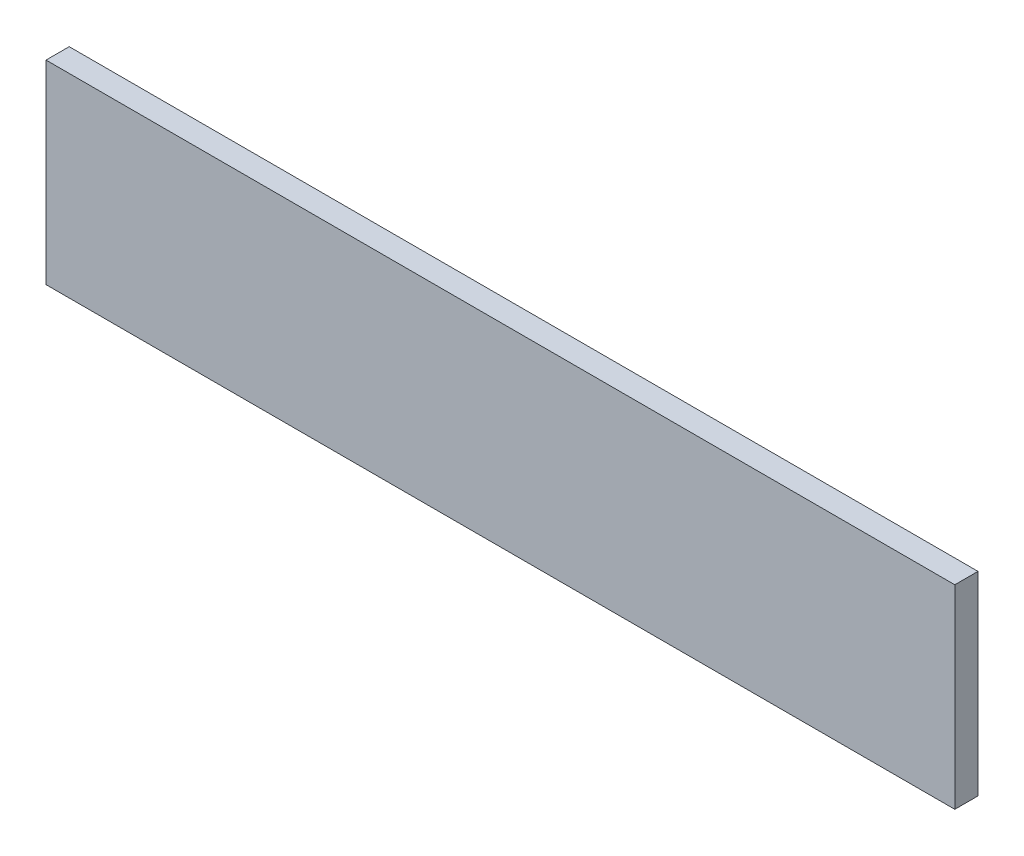
ISO-10303-21;
HEADER;
FILE_DESCRIPTION(('STEP AP214'),'2;1');
FILE_NAME('part.step','',(''),(''),'','','');
FILE_SCHEMA(('AUTOMOTIVE_DESIGN { 1 0 10303 214 1 1 1 1 }'));
ENDSEC;
DATA;
#1=APPLICATION_CONTEXT('core data for automotive mechanical design processes');
#2=APPLICATION_PROTOCOL_DEFINITION('international standard','automotive_design',2000,#1);
#3=PRODUCT_CONTEXT('',#1,'mechanical');
#4=PRODUCT('Part','Part','',(#3));
#5=PRODUCT_RELATED_PRODUCT_CATEGORY('part','',(#4));
#6=PRODUCT_DEFINITION_FORMATION('','',#4);
#7=PRODUCT_DEFINITION_CONTEXT('part definition',#1,'design');
#8=PRODUCT_DEFINITION('design','',#6,#7);
#9=PRODUCT_DEFINITION_SHAPE('','',#8);
#10=(LENGTH_UNIT() NAMED_UNIT(*) SI_UNIT(.MILLI.,.METRE.));
#11=(NAMED_UNIT(*) PLANE_ANGLE_UNIT() SI_UNIT($,.RADIAN.));
#12=(NAMED_UNIT(*) SI_UNIT($,.STERADIAN.) SOLID_ANGLE_UNIT());
#13=UNCERTAINTY_MEASURE_WITH_UNIT(LENGTH_MEASURE(1.E-05),#10,'distance_accuracy_value','');
#14=(GEOMETRIC_REPRESENTATION_CONTEXT(3) GLOBAL_UNCERTAINTY_ASSIGNED_CONTEXT((#13)) GLOBAL_UNIT_ASSIGNED_CONTEXT((#10,
#11,#12)) REPRESENTATION_CONTEXT('',''));
#15=CARTESIAN_POINT('',(0.,0.,0.));
#16=DIRECTION('',(0.,0.,1.));
#17=DIRECTION('',(1.,0.,0.));
#18=AXIS2_PLACEMENT_3D('',#15,#16,#17);
#19=CARTESIAN_POINT('',(1018.62875354254,-217.994596263324,52.0000000000001));
#20=DIRECTION('',(1.,0.,0.));
#21=DIRECTION('',(0.,0.,-1.));
#22=AXIS2_PLACEMENT_3D('',#19,#20,#21);
#23=PLANE('',#22);
#24=DIRECTION('',(0.,-1.,0.));
#25=VECTOR('',#24,1.);
#26=CARTESIAN_POINT('',(1018.62875354254,-217.994596263324,0.));
#27=LINE('',#26,#25);
#28=CARTESIAN_POINT('',(1018.62875354254,217.994596263324,0.));
#29=VERTEX_POINT('',#28);
#30=CARTESIAN_POINT('',(1018.62875354254,-217.994596263324,0.));
#31=VERTEX_POINT('',#30);
#32=EDGE_CURVE('E117',#29,#31,#27,.T.);
#33=ORIENTED_EDGE('',*,*,#32,.F.);
#34=DIRECTION('',(0.,0.,-1.));
#35=VECTOR('',#34,1.);
#36=CARTESIAN_POINT('',(1018.62875354254,217.994596263324,52.0000000000001));
#37=LINE('',#36,#35);
#38=CARTESIAN_POINT('',(1018.62875354254,217.994596263324,52.0000000000001));
#39=VERTEX_POINT('',#38);
#40=EDGE_CURVE('E12',#39,#29,#37,.T.);
#41=ORIENTED_EDGE('',*,*,#40,.F.);
#42=DIRECTION('',(0.,-1.,0.));
#43=VECTOR('',#42,1.);
#44=CARTESIAN_POINT('',(1018.62875354254,-217.994596263324,52.0000000000001));
#45=LINE('',#44,#43);
#46=CARTESIAN_POINT('',(1018.62875354254,-217.994596263324,52.0000000000001));
#47=VERTEX_POINT('',#46);
#48=EDGE_CURVE('E111',#39,#47,#45,.T.);
#49=ORIENTED_EDGE('',*,*,#48,.T.);
#50=DIRECTION('',(0.,0.,-1.));
#51=VECTOR('',#50,1.);
#52=CARTESIAN_POINT('',(1018.62875354254,-217.994596263324,52.0000000000001));
#53=LINE('',#52,#51);
#54=EDGE_CURVE('E56',#47,#31,#53,.T.);
#55=ORIENTED_EDGE('',*,*,#54,.T.);
#56=EDGE_LOOP('',(#33,#41,#49,#55));
#57=FACE_BOUND('',#56,.T.);
#58=ADVANCED_FACE('F53',(#57),#23,.T.);
#59=CARTESIAN_POINT('',(-1018.62875354254,217.994596263324,52.0000000000001));
#60=DIRECTION('',(0.,1.,0.));
#61=DIRECTION('',(0.,0.,1.));
#62=AXIS2_PLACEMENT_3D('',#59,#60,#61);
#63=PLANE('',#62);
#64=DIRECTION('',(1.,0.,0.));
#65=VECTOR('',#64,1.);
#66=CARTESIAN_POINT('',(-1018.62875354254,217.994596263324,0.));
#67=LINE('',#66,#65);
#68=CARTESIAN_POINT('',(-1018.62875354254,217.994596263324,0.));
#69=VERTEX_POINT('',#68);
#70=EDGE_CURVE('E113',#69,#29,#67,.T.);
#71=ORIENTED_EDGE('',*,*,#70,.F.);
#72=DIRECTION('',(0.,0.,-1.));
#73=VECTOR('',#72,1.);
#74=CARTESIAN_POINT('',(-1018.62875354254,217.994596263324,52.0000000000001));
#75=LINE('',#74,#73);
#76=CARTESIAN_POINT('',(-1018.62875354254,217.994596263324,52.0000000000001));
#77=VERTEX_POINT('',#76);
#78=EDGE_CURVE('E62',#77,#69,#75,.T.);
#79=ORIENTED_EDGE('',*,*,#78,.F.);
#80=DIRECTION('',(1.,0.,0.));
#81=VECTOR('',#80,1.);
#82=CARTESIAN_POINT('',(-1018.62875354254,217.994596263324,52.0000000000001));
#83=LINE('',#82,#81);
#84=EDGE_CURVE('E108',#77,#39,#83,.T.);
#85=ORIENTED_EDGE('',*,*,#84,.T.);
#86=ORIENTED_EDGE('',*,*,#40,.T.);
#87=EDGE_LOOP('',(#71,#79,#85,#86));
#88=FACE_BOUND('',#87,.T.);
#89=ADVANCED_FACE('F127',(#88),#63,.T.);
#90=CARTESIAN_POINT('',(-1018.62875354254,-217.994596263324,52.0000000000001));
#91=DIRECTION('',(-1.,0.,0.));
#92=DIRECTION('',(0.,0.,1.));
#93=AXIS2_PLACEMENT_3D('',#90,#91,#92);
#94=PLANE('',#93);
#95=DIRECTION('',(0.,1.,0.));
#96=VECTOR('',#95,1.);
#97=CARTESIAN_POINT('',(-1018.62875354254,-217.994596263324,0.));
#98=LINE('',#97,#96);
#99=CARTESIAN_POINT('',(-1018.62875354254,-217.994596263324,0.));
#100=VERTEX_POINT('',#99);
#101=EDGE_CURVE('E103',#100,#69,#98,.T.);
#102=ORIENTED_EDGE('',*,*,#101,.F.);
#103=DIRECTION('',(0.,0.,-1.));
#104=VECTOR('',#103,1.);
#105=CARTESIAN_POINT('',(-1018.62875354254,-217.994596263324,52.0000000000001));
#106=LINE('',#105,#104);
#107=CARTESIAN_POINT('',(-1018.62875354254,-217.994596263324,52.0000000000001));
#108=VERTEX_POINT('',#107);
#109=EDGE_CURVE('E98',#108,#100,#106,.T.);
#110=ORIENTED_EDGE('',*,*,#109,.F.);
#111=DIRECTION('',(0.,1.,0.));
#112=VECTOR('',#111,1.);
#113=CARTESIAN_POINT('',(-1018.62875354254,-217.994596263324,52.0000000000001));
#114=LINE('',#113,#112);
#115=EDGE_CURVE('E101',#108,#77,#114,.T.);
#116=ORIENTED_EDGE('',*,*,#115,.T.);
#117=ORIENTED_EDGE('',*,*,#78,.T.);
#118=EDGE_LOOP('',(#102,#110,#116,#117));
#119=FACE_BOUND('',#118,.T.);
#120=ADVANCED_FACE('F100',(#119),#94,.T.);
#121=CARTESIAN_POINT('',(-1018.62875354254,-217.994596263324,52.0000000000001));
#122=DIRECTION('',(0.,-1.,0.));
#123=DIRECTION('',(0.,0.,-1.));
#124=AXIS2_PLACEMENT_3D('',#121,#122,#123);
#125=PLANE('',#124);
#126=DIRECTION('',(-1.,0.,0.));
#127=VECTOR('',#126,1.);
#128=CARTESIAN_POINT('',(-1018.62875354254,-217.994596263324,0.));
#129=LINE('',#128,#127);
#130=EDGE_CURVE('E120',#31,#100,#129,.T.);
#131=ORIENTED_EDGE('',*,*,#130,.F.);
#132=ORIENTED_EDGE('',*,*,#54,.F.);
#133=DIRECTION('',(-1.,0.,0.));
#134=VECTOR('',#133,1.);
#135=CARTESIAN_POINT('',(-1018.62875354254,-217.994596263324,52.0000000000001));
#136=LINE('',#135,#134);
#137=EDGE_CURVE('E107',#47,#108,#136,.T.);
#138=ORIENTED_EDGE('',*,*,#137,.T.);
#139=ORIENTED_EDGE('',*,*,#109,.T.);
#140=EDGE_LOOP('',(#131,#132,#138,#139));
#141=FACE_BOUND('',#140,.T.);
#142=ADVANCED_FACE('F110',(#141),#125,.T.);
#143=CARTESIAN_POINT('',(0.,0.,52.0000000000001));
#144=DIRECTION('',(0.,0.,-1.));
#145=DIRECTION('',(-1.,0.,0.));
#146=AXIS2_PLACEMENT_3D('',#143,#144,#145);
#147=PLANE('',#146);
#148=ORIENTED_EDGE('',*,*,#48,.F.);
#149=ORIENTED_EDGE('',*,*,#84,.F.);
#150=ORIENTED_EDGE('',*,*,#115,.F.);
#151=ORIENTED_EDGE('',*,*,#137,.F.);
#152=EDGE_LOOP('',(#148,#149,#150,#151));
#153=FACE_BOUND('',#152,.T.);
#154=ADVANCED_FACE('F106',(#153),#147,.F.);
#155=CARTESIAN_POINT('',(0.,0.,0.));
#156=DIRECTION('',(0.,0.,-1.));
#157=DIRECTION('',(-1.,0.,0.));
#158=AXIS2_PLACEMENT_3D('',#155,#156,#157);
#159=PLANE('',#158);
#160=ORIENTED_EDGE('',*,*,#32,.T.);
#161=ORIENTED_EDGE('',*,*,#130,.T.);
#162=ORIENTED_EDGE('',*,*,#101,.T.);
#163=ORIENTED_EDGE('',*,*,#70,.T.);
#164=EDGE_LOOP('',(#160,#161,#162,#163));
#165=FACE_BOUND('',#164,.T.);
#166=ADVANCED_FACE('F126',(#165),#159,.T.);
#167=CLOSED_SHELL('',(#58,#89,#120,#142,#154,#166));
#168=MANIFOLD_SOLID_BREP('B2',#167);
#169=CARTESIAN_POINT('',(1000.,200.,40.));
#170=DIRECTION('',(-1.,0.,0.));
#171=DIRECTION('',(0.,0.,1.));
#172=AXIS2_PLACEMENT_3D('',#169,#170,#171);
#173=PLANE('',#172);
#174=DIRECTION('',(0.,1.,0.));
#175=VECTOR('',#174,1.);
#176=CARTESIAN_POINT('',(1000.,200.,0.));
#177=LINE('',#176,#175);
#178=CARTESIAN_POINT('',(1000.,-200.,0.));
#179=VERTEX_POINT('',#178);
#180=CARTESIAN_POINT('',(1000.,200.,0.));
#181=VERTEX_POINT('',#180);
#182=EDGE_CURVE('E240',#179,#181,#177,.T.);
#183=ORIENTED_EDGE('',*,*,#182,.T.);
#184=DIRECTION('',(0.,0.,-1.));
#185=VECTOR('',#184,1.);
#186=CARTESIAN_POINT('',(1000.,200.,40.));
#187=LINE('',#186,#185);
#188=CARTESIAN_POINT('',(1000.,200.,40.));
#189=VERTEX_POINT('',#188);
#190=EDGE_CURVE('E51',#189,#181,#187,.T.);
#191=ORIENTED_EDGE('',*,*,#190,.F.);
#192=DIRECTION('',(0.,1.,0.));
#193=VECTOR('',#192,1.);
#194=CARTESIAN_POINT('',(1000.,200.,40.));
#195=LINE('',#194,#193);
#196=CARTESIAN_POINT('',(1000.,-200.,40.));
#197=VERTEX_POINT('',#196);
#198=EDGE_CURVE('E228',#197,#189,#195,.T.);
#199=ORIENTED_EDGE('',*,*,#198,.F.);
#200=DIRECTION('',(0.,0.,-1.));
#201=VECTOR('',#200,1.);
#202=CARTESIAN_POINT('',(1000.,-200.,40.));
#203=LINE('',#202,#201);
#204=EDGE_CURVE('E236',#197,#179,#203,.T.);
#205=ORIENTED_EDGE('',*,*,#204,.T.);
#206=EDGE_LOOP('',(#183,#191,#199,#205));
#207=FACE_BOUND('',#206,.T.);
#208=ADVANCED_FACE('F177',(#207),#173,.F.);
#209=CARTESIAN_POINT('',(-1000.,200.,40.));
#210=DIRECTION('',(0.,-1.,0.));
#211=DIRECTION('',(0.,0.,-1.));
#212=AXIS2_PLACEMENT_3D('',#209,#210,#211);
#213=PLANE('',#212);
#214=DIRECTION('',(-1.,0.,0.));
#215=VECTOR('',#214,1.);
#216=CARTESIAN_POINT('',(-1000.,200.,0.));
#217=LINE('',#216,#215);
#218=CARTESIAN_POINT('',(-1000.,200.,0.));
#219=VERTEX_POINT('',#218);
#220=EDGE_CURVE('E232',#181,#219,#217,.T.);
#221=ORIENTED_EDGE('',*,*,#220,.T.);
#222=DIRECTION('',(0.,0.,-1.));
#223=VECTOR('',#222,1.);
#224=CARTESIAN_POINT('',(-1000.,200.,40.));
#225=LINE('',#224,#223);
#226=CARTESIAN_POINT('',(-1000.,200.,40.));
#227=VERTEX_POINT('',#226);
#228=EDGE_CURVE('E185',#227,#219,#225,.T.);
#229=ORIENTED_EDGE('',*,*,#228,.F.);
#230=DIRECTION('',(-1.,0.,0.));
#231=VECTOR('',#230,1.);
#232=CARTESIAN_POINT('',(-1000.,200.,40.));
#233=LINE('',#232,#231);
#234=EDGE_CURVE('E223',#189,#227,#233,.T.);
#235=ORIENTED_EDGE('',*,*,#234,.F.);
#236=ORIENTED_EDGE('',*,*,#190,.T.);
#237=EDGE_LOOP('',(#221,#229,#235,#236));
#238=FACE_BOUND('',#237,.T.);
#239=ADVANCED_FACE('F231',(#238),#213,.F.);
#240=CARTESIAN_POINT('',(-1000.,200.,40.));
#241=DIRECTION('',(1.,0.,0.));
#242=DIRECTION('',(0.,0.,-1.));
#243=AXIS2_PLACEMENT_3D('',#240,#241,#242);
#244=PLANE('',#243);
#245=DIRECTION('',(0.,-1.,0.));
#246=VECTOR('',#245,1.);
#247=CARTESIAN_POINT('',(-1000.,200.,0.));
#248=LINE('',#247,#246);
#249=CARTESIAN_POINT('',(-1000.,-200.,0.));
#250=VERTEX_POINT('',#249);
#251=EDGE_CURVE('E210',#219,#250,#248,.T.);
#252=ORIENTED_EDGE('',*,*,#251,.T.);
#253=DIRECTION('',(0.,0.,-1.));
#254=VECTOR('',#253,1.);
#255=CARTESIAN_POINT('',(-1000.,-200.,40.));
#256=LINE('',#255,#254);
#257=CARTESIAN_POINT('',(-1000.,-200.,40.));
#258=VERTEX_POINT('',#257);
#259=EDGE_CURVE('E233',#258,#250,#256,.T.);
#260=ORIENTED_EDGE('',*,*,#259,.F.);
#261=DIRECTION('',(0.,-1.,0.));
#262=VECTOR('',#261,1.);
#263=CARTESIAN_POINT('',(-1000.,200.,40.));
#264=LINE('',#263,#262);
#265=EDGE_CURVE('E226',#227,#258,#264,.T.);
#266=ORIENTED_EDGE('',*,*,#265,.F.);
#267=ORIENTED_EDGE('',*,*,#228,.T.);
#268=EDGE_LOOP('',(#252,#260,#266,#267));
#269=FACE_BOUND('',#268,.T.);
#270=ADVANCED_FACE('F234',(#269),#244,.F.);
#271=CARTESIAN_POINT('',(-1000.,-200.,40.));
#272=DIRECTION('',(0.,1.,0.));
#273=DIRECTION('',(0.,0.,1.));
#274=AXIS2_PLACEMENT_3D('',#271,#272,#273);
#275=PLANE('',#274);
#276=DIRECTION('',(1.,0.,0.));
#277=VECTOR('',#276,1.);
#278=CARTESIAN_POINT('',(-1000.,-200.,0.));
#279=LINE('',#278,#277);
#280=EDGE_CURVE('E216',#250,#179,#279,.T.);
#281=ORIENTED_EDGE('',*,*,#280,.T.);
#282=ORIENTED_EDGE('',*,*,#204,.F.);
#283=DIRECTION('',(1.,0.,0.));
#284=VECTOR('',#283,1.);
#285=CARTESIAN_POINT('',(-1000.,-200.,40.));
#286=LINE('',#285,#284);
#287=EDGE_CURVE('E193',#258,#197,#286,.T.);
#288=ORIENTED_EDGE('',*,*,#287,.F.);
#289=ORIENTED_EDGE('',*,*,#259,.T.);
#290=EDGE_LOOP('',(#281,#282,#288,#289));
#291=FACE_BOUND('',#290,.T.);
#292=ADVANCED_FACE('F247',(#291),#275,.F.);
#293=CARTESIAN_POINT('',(0.,0.,40.));
#294=DIRECTION('',(0.,0.,1.));
#295=DIRECTION('',(1.,0.,0.));
#296=AXIS2_PLACEMENT_3D('',#293,#294,#295);
#297=PLANE('',#296);
#298=ORIENTED_EDGE('',*,*,#198,.T.);
#299=ORIENTED_EDGE('',*,*,#234,.T.);
#300=ORIENTED_EDGE('',*,*,#265,.T.);
#301=ORIENTED_EDGE('',*,*,#287,.T.);
#302=EDGE_LOOP('',(#298,#299,#300,#301));
#303=FACE_BOUND('',#302,.T.);
#304=ADVANCED_FACE('F224',(#303),#297,.T.);
#305=CARTESIAN_POINT('',(0.,0.,0.));
#306=DIRECTION('',(0.,0.,1.));
#307=DIRECTION('',(1.,0.,0.));
#308=AXIS2_PLACEMENT_3D('',#305,#306,#307);
#309=PLANE('',#308);
#310=ORIENTED_EDGE('',*,*,#182,.F.);
#311=ORIENTED_EDGE('',*,*,#280,.F.);
#312=ORIENTED_EDGE('',*,*,#251,.F.);
#313=ORIENTED_EDGE('',*,*,#220,.F.);
#314=EDGE_LOOP('',(#310,#311,#312,#313));
#315=FACE_BOUND('',#314,.T.);
#316=ADVANCED_FACE('F250',(#315),#309,.F.);
#317=CLOSED_SHELL('',(#208,#239,#270,#292,#304,#316));
#318=MANIFOLD_SOLID_BREP('B6',#317);
#319=ADVANCED_BREP_SHAPE_REPRESENTATION('',(#18,#168,#318),#14);
#320=SHAPE_DEFINITION_REPRESENTATION(#9,#319);
ENDSEC;
END-ISO-10303-21;
